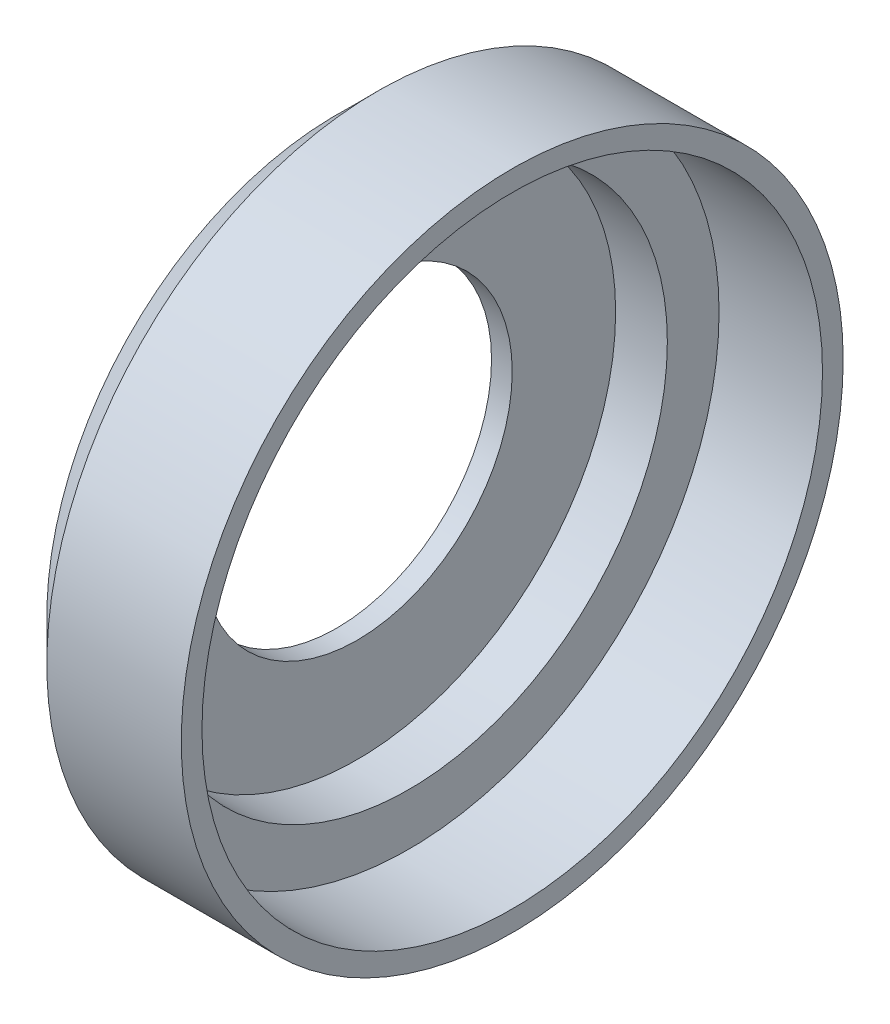
ISO-10303-21;
HEADER;
FILE_DESCRIPTION(('STEP AP214'),'2;1');
FILE_NAME('part.step','',(''),(''),'','','');
FILE_SCHEMA(('AUTOMOTIVE_DESIGN { 1 0 10303 214 1 1 1 1 }'));
ENDSEC;
DATA;
#1=APPLICATION_CONTEXT('core data for automotive mechanical design processes');
#2=APPLICATION_PROTOCOL_DEFINITION('international standard','automotive_design',2000,#1);
#3=PRODUCT_CONTEXT('',#1,'mechanical');
#4=PRODUCT('Part','Part','',(#3));
#5=PRODUCT_RELATED_PRODUCT_CATEGORY('part','',(#4));
#6=PRODUCT_DEFINITION_FORMATION('','',#4);
#7=PRODUCT_DEFINITION_CONTEXT('part definition',#1,'design');
#8=PRODUCT_DEFINITION('design','',#6,#7);
#9=PRODUCT_DEFINITION_SHAPE('','',#8);
#10=(LENGTH_UNIT() NAMED_UNIT(*) SI_UNIT(.MILLI.,.METRE.));
#11=(NAMED_UNIT(*) PLANE_ANGLE_UNIT() SI_UNIT($,.RADIAN.));
#12=(NAMED_UNIT(*) SI_UNIT($,.STERADIAN.) SOLID_ANGLE_UNIT());
#13=UNCERTAINTY_MEASURE_WITH_UNIT(LENGTH_MEASURE(1.E-05),#10,'distance_accuracy_value','');
#14=(GEOMETRIC_REPRESENTATION_CONTEXT(3) GLOBAL_UNCERTAINTY_ASSIGNED_CONTEXT((#13)) GLOBAL_UNIT_ASSIGNED_CONTEXT((#10,
#11,#12)) REPRESENTATION_CONTEXT('',''));
#15=CARTESIAN_POINT('',(0.,0.,0.));
#16=DIRECTION('',(0.,0.,1.));
#17=DIRECTION('',(1.,0.,0.));
#18=AXIS2_PLACEMENT_3D('',#15,#16,#17);
#19=CARTESIAN_POINT('',(-11.3395464786513,0.,-9.525));
#20=DIRECTION('',(-1.,0.,0.));
#21=DIRECTION('',(0.,0.,1.));
#22=AXIS2_PLACEMENT_3D('',#19,#20,#21);
#23=PLANE('',#22);
#24=CARTESIAN_POINT('',(-11.3395464786513,0.,0.));
#25=DIRECTION('',(1.,0.,0.));
#26=DIRECTION('',(0.,0.,-1.));
#27=AXIS2_PLACEMENT_3D('',#24,#25,#26);
#28=CIRCLE('',#27,9.525);
#29=CARTESIAN_POINT('',(-11.3395464786513,0.,-9.525));
#30=VERTEX_POINT('',#29);
#31=EDGE_CURVE('E76',#30,#30,#28,.T.);
#32=ORIENTED_EDGE('',*,*,#31,.T.);
#33=EDGE_LOOP('',(#32));
#34=FACE_BOUND('',#33,.T.);
#35=CARTESIAN_POINT('',(-11.3395464786513,0.,0.));
#36=DIRECTION('',(1.,0.,0.));
#37=DIRECTION('',(0.,0.,-1.));
#38=AXIS2_PLACEMENT_3D('',#35,#36,#37);
#39=CIRCLE('',#38,17.78);
#40=CARTESIAN_POINT('',(-11.3395464786513,0.,-17.78));
#41=VERTEX_POINT('',#40);
#42=EDGE_CURVE('E10',#41,#41,#39,.T.);
#43=ORIENTED_EDGE('',*,*,#42,.F.);
#44=EDGE_LOOP('',(#43));
#45=FACE_BOUND('',#44,.T.);
#46=ADVANCED_FACE('F37',(#34,#45),#23,.T.);
#47=CARTESIAN_POINT('',(-8.79954647865127,0.,0.));
#48=DIRECTION('',(1.,0.,0.));
#49=DIRECTION('',(0.,0.,-1.));
#50=AXIS2_PLACEMENT_3D('',#47,#48,#49);
#51=CONICAL_SURFACE('',#50,20.32,0.785398163397449);
#52=ORIENTED_EDGE('',*,*,#42,.T.);
#53=EDGE_LOOP('',(#52));
#54=FACE_BOUND('',#53,.T.);
#55=CARTESIAN_POINT('',(-8.79954647865127,0.,0.));
#56=DIRECTION('',(1.,0.,0.));
#57=DIRECTION('',(0.,0.,-1.));
#58=AXIS2_PLACEMENT_3D('',#55,#56,#57);
#59=CIRCLE('',#58,20.32);
#60=CARTESIAN_POINT('',(-8.79954647865127,0.,-20.32));
#61=VERTEX_POINT('',#60);
#62=EDGE_CURVE('E44',#61,#61,#59,.T.);
#63=ORIENTED_EDGE('',*,*,#62,.F.);
#64=EDGE_LOOP('',(#63));
#65=FACE_BOUND('',#64,.T.);
#66=ADVANCED_FACE('F95',(#54,#65),#51,.T.);
#67=CARTESIAN_POINT('',(0.,0.,0.));
#68=DIRECTION('',(1.,0.,0.));
#69=DIRECTION('',(0.,0.,-1.));
#70=AXIS2_PLACEMENT_3D('',#67,#68,#69);
#71=CYLINDRICAL_SURFACE('',#70,20.32);
#72=ORIENTED_EDGE('',*,*,#62,.T.);
#73=EDGE_LOOP('',(#72));
#74=FACE_BOUND('',#73,.T.);
#75=CARTESIAN_POINT('',(-0.544546478651273,0.,0.));
#76=DIRECTION('',(1.,0.,0.));
#77=DIRECTION('',(0.,0.,-1.));
#78=AXIS2_PLACEMENT_3D('',#75,#76,#77);
#79=CIRCLE('',#78,20.32);
#80=CARTESIAN_POINT('',(-0.544546478651273,0.,-20.32));
#81=VERTEX_POINT('',#80);
#82=EDGE_CURVE('E49',#81,#81,#79,.T.);
#83=ORIENTED_EDGE('',*,*,#82,.F.);
#84=EDGE_LOOP('',(#83));
#85=FACE_BOUND('',#84,.T.);
#86=ADVANCED_FACE('F99',(#74,#85),#71,.T.);
#87=CARTESIAN_POINT('',(-0.544546478651273,0.,-20.32));
#88=DIRECTION('',(1.,0.,0.));
#89=DIRECTION('',(0.,0.,-1.));
#90=AXIS2_PLACEMENT_3D('',#87,#88,#89);
#91=PLANE('',#90);
#92=ORIENTED_EDGE('',*,*,#82,.T.);
#93=EDGE_LOOP('',(#92));
#94=FACE_BOUND('',#93,.T.);
#95=CARTESIAN_POINT('',(-0.544546478651273,0.,0.));
#96=DIRECTION('',(1.,0.,0.));
#97=DIRECTION('',(0.,0.,-1.));
#98=AXIS2_PLACEMENT_3D('',#95,#96,#97);
#99=CIRCLE('',#98,19.05);
#100=CARTESIAN_POINT('',(-0.544546478651273,0.,-19.05));
#101=VERTEX_POINT('',#100);
#102=EDGE_CURVE('E54',#101,#101,#99,.T.);
#103=ORIENTED_EDGE('',*,*,#102,.F.);
#104=EDGE_LOOP('',(#103));
#105=FACE_BOUND('',#104,.T.);
#106=ADVANCED_FACE('F103',(#94,#105),#91,.T.);
#107=CARTESIAN_POINT('',(0.,0.,0.));
#108=DIRECTION('',(1.,0.,0.));
#109=DIRECTION('',(0.,0.,-1.));
#110=AXIS2_PLACEMENT_3D('',#107,#108,#109);
#111=CYLINDRICAL_SURFACE('',#110,19.05);
#112=ORIENTED_EDGE('',*,*,#102,.T.);
#113=EDGE_LOOP('',(#112));
#114=FACE_BOUND('',#113,.T.);
#115=CARTESIAN_POINT('',(-6.89454647865127,0.,0.));
#116=DIRECTION('',(1.,0.,0.));
#117=DIRECTION('',(0.,0.,-1.));
#118=AXIS2_PLACEMENT_3D('',#115,#116,#117);
#119=CIRCLE('',#118,19.05);
#120=CARTESIAN_POINT('',(-6.89454647865127,0.,-19.05));
#121=VERTEX_POINT('',#120);
#122=EDGE_CURVE('E60',#121,#121,#119,.T.);
#123=ORIENTED_EDGE('',*,*,#122,.F.);
#124=EDGE_LOOP('',(#123));
#125=FACE_BOUND('',#124,.T.);
#126=ADVANCED_FACE('F109',(#114,#125),#111,.F.);
#127=CARTESIAN_POINT('',(-6.89454647865127,0.,-19.05));
#128=DIRECTION('',(1.,0.,0.));
#129=DIRECTION('',(0.,0.,-1.));
#130=AXIS2_PLACEMENT_3D('',#127,#128,#129);
#131=PLANE('',#130);
#132=ORIENTED_EDGE('',*,*,#122,.T.);
#133=EDGE_LOOP('',(#132));
#134=FACE_BOUND('',#133,.T.);
#135=CARTESIAN_POINT('',(-6.89454647865127,0.,0.));
#136=DIRECTION('',(1.,0.,0.));
#137=DIRECTION('',(0.,0.,-1.));
#138=AXIS2_PLACEMENT_3D('',#135,#136,#137);
#139=CIRCLE('',#138,15.875);
#140=CARTESIAN_POINT('',(-6.89454647865127,0.,-15.875));
#141=VERTEX_POINT('',#140);
#142=EDGE_CURVE('E64',#141,#141,#139,.T.);
#143=ORIENTED_EDGE('',*,*,#142,.F.);
#144=EDGE_LOOP('',(#143));
#145=FACE_BOUND('',#144,.T.);
#146=ADVANCED_FACE('F113',(#134,#145),#131,.T.);
#147=CARTESIAN_POINT('',(0.,0.,0.));
#148=DIRECTION('',(1.,0.,0.));
#149=DIRECTION('',(0.,0.,-1.));
#150=AXIS2_PLACEMENT_3D('',#147,#148,#149);
#151=CYLINDRICAL_SURFACE('',#150,15.875);
#152=ORIENTED_EDGE('',*,*,#142,.T.);
#153=EDGE_LOOP('',(#152));
#154=FACE_BOUND('',#153,.T.);
#155=CARTESIAN_POINT('',(-10.0695464786513,0.,0.));
#156=DIRECTION('',(1.,0.,0.));
#157=DIRECTION('',(0.,0.,-1.));
#158=AXIS2_PLACEMENT_3D('',#155,#156,#157);
#159=CIRCLE('',#158,15.875);
#160=CARTESIAN_POINT('',(-10.0695464786513,0.,-15.875));
#161=VERTEX_POINT('',#160);
#162=EDGE_CURVE('E68',#161,#161,#159,.T.);
#163=ORIENTED_EDGE('',*,*,#162,.F.);
#164=EDGE_LOOP('',(#163));
#165=FACE_BOUND('',#164,.T.);
#166=ADVANCED_FACE('F91',(#154,#165),#151,.F.);
#167=CARTESIAN_POINT('',(-10.0695464786513,0.,-9.525));
#168=DIRECTION('',(1.,0.,0.));
#169=DIRECTION('',(0.,0.,-1.));
#170=AXIS2_PLACEMENT_3D('',#167,#168,#169);
#171=PLANE('',#170);
#172=ORIENTED_EDGE('',*,*,#162,.T.);
#173=EDGE_LOOP('',(#172));
#174=FACE_BOUND('',#173,.T.);
#175=CARTESIAN_POINT('',(-10.0695464786513,0.,0.));
#176=DIRECTION('',(1.,0.,0.));
#177=DIRECTION('',(0.,0.,-1.));
#178=AXIS2_PLACEMENT_3D('',#175,#176,#177);
#179=CIRCLE('',#178,9.525);
#180=CARTESIAN_POINT('',(-10.0695464786513,0.,-9.525));
#181=VERTEX_POINT('',#180);
#182=EDGE_CURVE('E72',#181,#181,#179,.T.);
#183=ORIENTED_EDGE('',*,*,#182,.F.);
#184=EDGE_LOOP('',(#183));
#185=FACE_BOUND('',#184,.T.);
#186=ADVANCED_FACE('F85',(#174,#185),#171,.T.);
#187=CARTESIAN_POINT('',(0.,0.,0.));
#188=DIRECTION('',(1.,0.,0.));
#189=DIRECTION('',(0.,0.,-1.));
#190=AXIS2_PLACEMENT_3D('',#187,#188,#189);
#191=CYLINDRICAL_SURFACE('',#190,9.525);
#192=ORIENTED_EDGE('',*,*,#182,.T.);
#193=EDGE_LOOP('',(#192));
#194=FACE_BOUND('',#193,.T.);
#195=ORIENTED_EDGE('',*,*,#31,.F.);
#196=EDGE_LOOP('',(#195));
#197=FACE_BOUND('',#196,.T.);
#198=ADVANCED_FACE('F83',(#194,#197),#191,.F.);
#199=CLOSED_SHELL('',(#46,#66,#86,#106,#126,#146,#166,#186,#198));
#200=MANIFOLD_SOLID_BREP('B2',#199);
#201=ADVANCED_BREP_SHAPE_REPRESENTATION('',(#18,#200),#14);
#202=SHAPE_DEFINITION_REPRESENTATION(#9,#201);
ENDSEC;
END-ISO-10303-21;
